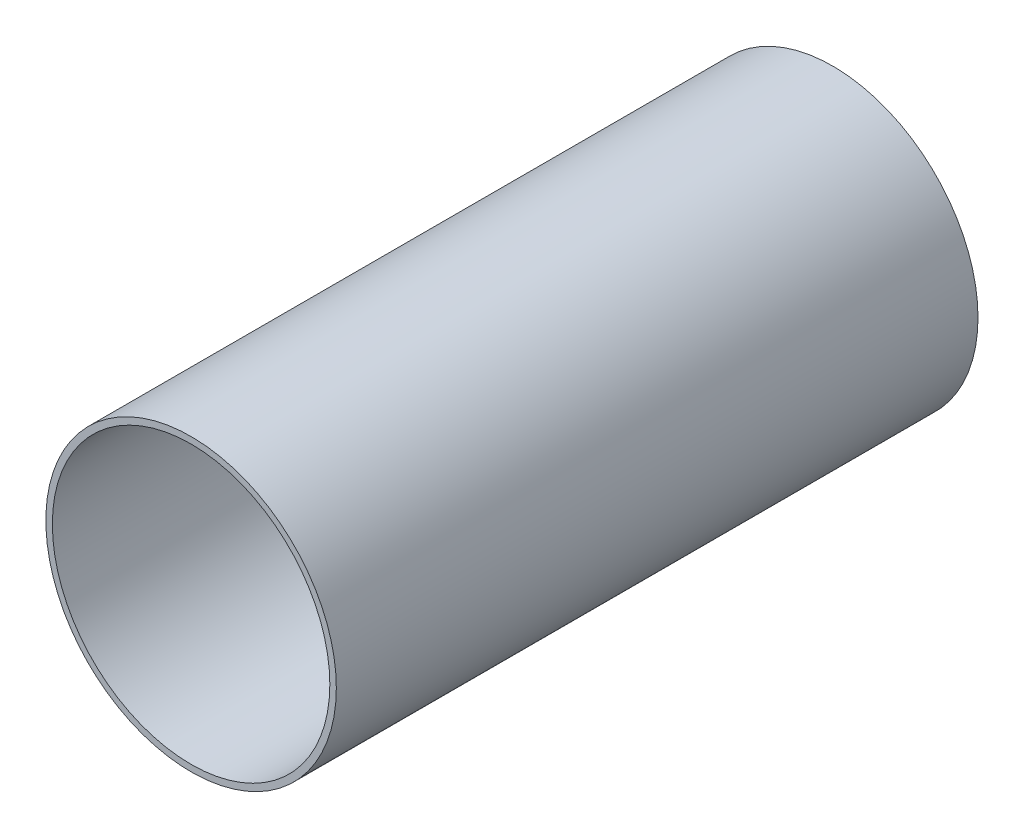
ISO-10303-21;
HEADER;
FILE_DESCRIPTION(('STEP AP214'),'2;1');
FILE_NAME('part.step','',(''),(''),'','','');
FILE_SCHEMA(('AUTOMOTIVE_DESIGN { 1 0 10303 214 1 1 1 1 }'));
ENDSEC;
DATA;
#1=APPLICATION_CONTEXT('core data for automotive mechanical design processes');
#2=APPLICATION_PROTOCOL_DEFINITION('international standard','automotive_design',2000,#1);
#3=PRODUCT_CONTEXT('',#1,'mechanical');
#4=PRODUCT('Part','Part','',(#3));
#5=PRODUCT_RELATED_PRODUCT_CATEGORY('part','',(#4));
#6=PRODUCT_DEFINITION_FORMATION('','',#4);
#7=PRODUCT_DEFINITION_CONTEXT('part definition',#1,'design');
#8=PRODUCT_DEFINITION('design','',#6,#7);
#9=PRODUCT_DEFINITION_SHAPE('','',#8);
#10=(LENGTH_UNIT() NAMED_UNIT(*) SI_UNIT(.MILLI.,.METRE.));
#11=(NAMED_UNIT(*) PLANE_ANGLE_UNIT() SI_UNIT($,.RADIAN.));
#12=(NAMED_UNIT(*) SI_UNIT($,.STERADIAN.) SOLID_ANGLE_UNIT());
#13=UNCERTAINTY_MEASURE_WITH_UNIT(LENGTH_MEASURE(1.E-05),#10,'distance_accuracy_value','');
#14=(GEOMETRIC_REPRESENTATION_CONTEXT(3) GLOBAL_UNCERTAINTY_ASSIGNED_CONTEXT((#13)) GLOBAL_UNIT_ASSIGNED_CONTEXT((#10,
#11,#12)) REPRESENTATION_CONTEXT('',''));
#15=CARTESIAN_POINT('',(0.,0.,0.));
#16=DIRECTION('',(0.,0.,1.));
#17=DIRECTION('',(1.,0.,0.));
#18=AXIS2_PLACEMENT_3D('',#15,#16,#17);
#19=CARTESIAN_POINT('',(0.,0.,234.95));
#20=DIRECTION('',(0.,0.,1.));
#21=DIRECTION('',(1.,0.,0.));
#22=AXIS2_PLACEMENT_3D('',#19,#20,#21);
#23=PLANE('',#22);
#24=CARTESIAN_POINT('',(0.,0.,234.95));
#25=DIRECTION('',(0.,0.,1.));
#26=DIRECTION('',(1.,0.,0.));
#27=AXIS2_PLACEMENT_3D('',#24,#25,#26);
#28=CIRCLE('',#27,53.18125);
#29=CARTESIAN_POINT('',(53.18125,0.,234.95));
#30=VERTEX_POINT('',#29);
#31=EDGE_CURVE('E10',#30,#30,#28,.T.);
#32=ORIENTED_EDGE('',*,*,#31,.T.);
#33=EDGE_LOOP('',(#32));
#34=FACE_BOUND('',#33,.T.);
#35=CARTESIAN_POINT('',(0.,0.,234.95));
#36=DIRECTION('',(0.,0.,1.));
#37=DIRECTION('',(1.,0.,0.));
#38=AXIS2_PLACEMENT_3D('',#35,#36,#37);
#39=CIRCLE('',#38,50.8);
#40=CARTESIAN_POINT('',(50.8,0.,234.95));
#41=VERTEX_POINT('',#40);
#42=EDGE_CURVE('E48',#41,#41,#39,.T.);
#43=ORIENTED_EDGE('',*,*,#42,.F.);
#44=EDGE_LOOP('',(#43));
#45=FACE_BOUND('',#44,.T.);
#46=ADVANCED_FACE('F37',(#34,#45),#23,.T.);
#47=CARTESIAN_POINT('',(0.,0.,0.));
#48=DIRECTION('',(0.,0.,1.));
#49=DIRECTION('',(1.,0.,0.));
#50=AXIS2_PLACEMENT_3D('',#47,#48,#49);
#51=PLANE('',#50);
#52=CARTESIAN_POINT('',(0.,0.,0.));
#53=DIRECTION('',(0.,0.,1.));
#54=DIRECTION('',(1.,0.,0.));
#55=AXIS2_PLACEMENT_3D('',#52,#53,#54);
#56=CIRCLE('',#55,53.18125);
#57=CARTESIAN_POINT('',(53.18125,0.,0.));
#58=VERTEX_POINT('',#57);
#59=EDGE_CURVE('E41',#58,#58,#56,.T.);
#60=ORIENTED_EDGE('',*,*,#59,.F.);
#61=EDGE_LOOP('',(#60));
#62=FACE_BOUND('',#61,.T.);
#63=CARTESIAN_POINT('',(0.,0.,0.));
#64=DIRECTION('',(0.,0.,1.));
#65=DIRECTION('',(1.,0.,0.));
#66=AXIS2_PLACEMENT_3D('',#63,#64,#65);
#67=CIRCLE('',#66,50.8);
#68=CARTESIAN_POINT('',(50.8,0.,0.));
#69=VERTEX_POINT('',#68);
#70=EDGE_CURVE('E50',#69,#69,#67,.T.);
#71=ORIENTED_EDGE('',*,*,#70,.T.);
#72=EDGE_LOOP('',(#71));
#73=FACE_BOUND('',#72,.T.);
#74=ADVANCED_FACE('F60',(#62,#73),#51,.F.);
#75=CARTESIAN_POINT('',(0.,0.,234.95));
#76=DIRECTION('',(0.,0.,-1.));
#77=DIRECTION('',(-1.,0.,0.));
#78=AXIS2_PLACEMENT_3D('',#75,#76,#77);
#79=CYLINDRICAL_SURFACE('',#78,53.18125);
#80=ORIENTED_EDGE('',*,*,#31,.F.);
#81=EDGE_LOOP('',(#80));
#82=FACE_BOUND('',#81,.T.);
#83=ORIENTED_EDGE('',*,*,#59,.T.);
#84=EDGE_LOOP('',(#83));
#85=FACE_BOUND('',#84,.T.);
#86=ADVANCED_FACE('F39',(#82,#85),#79,.T.);
#87=CARTESIAN_POINT('',(0.,0.,234.95));
#88=DIRECTION('',(0.,0.,-1.));
#89=DIRECTION('',(-1.,0.,0.));
#90=AXIS2_PLACEMENT_3D('',#87,#88,#89);
#91=CYLINDRICAL_SURFACE('',#90,50.8);
#92=ORIENTED_EDGE('',*,*,#42,.T.);
#93=EDGE_LOOP('',(#92));
#94=FACE_BOUND('',#93,.T.);
#95=ORIENTED_EDGE('',*,*,#70,.F.);
#96=EDGE_LOOP('',(#95));
#97=FACE_BOUND('',#96,.T.);
#98=ADVANCED_FACE('F56',(#94,#97),#91,.F.);
#99=CLOSED_SHELL('',(#46,#74,#86,#98));
#100=MANIFOLD_SOLID_BREP('B2',#99);
#101=ADVANCED_BREP_SHAPE_REPRESENTATION('',(#18,#100),#14);
#102=SHAPE_DEFINITION_REPRESENTATION(#9,#101);
ENDSEC;
END-ISO-10303-21;
